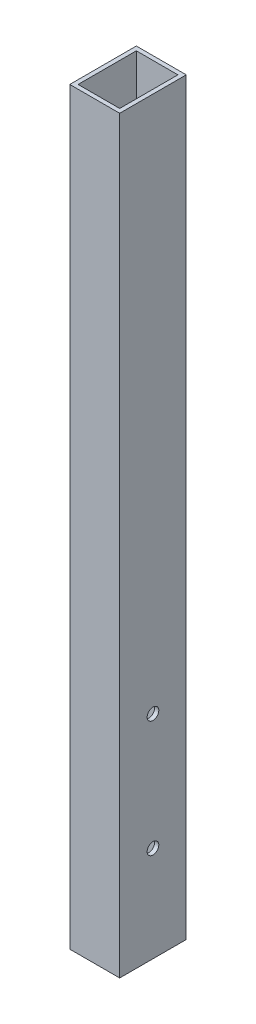
ISO-10303-21;
HEADER;
FILE_DESCRIPTION(('STEP AP214'),'2;1');
FILE_NAME('part.step','',(''),(''),'','','');
FILE_SCHEMA(('AUTOMOTIVE_DESIGN { 1 0 10303 214 1 1 1 1 }'));
ENDSEC;
DATA;
#1=APPLICATION_CONTEXT('core data for automotive mechanical design processes');
#2=APPLICATION_PROTOCOL_DEFINITION('international standard','automotive_design',2000,#1);
#3=PRODUCT_CONTEXT('',#1,'mechanical');
#4=PRODUCT('Part','Part','',(#3));
#5=PRODUCT_RELATED_PRODUCT_CATEGORY('part','',(#4));
#6=PRODUCT_DEFINITION_FORMATION('','',#4);
#7=PRODUCT_DEFINITION_CONTEXT('part definition',#1,'design');
#8=PRODUCT_DEFINITION('design','',#6,#7);
#9=PRODUCT_DEFINITION_SHAPE('','',#8);
#10=(LENGTH_UNIT() NAMED_UNIT(*) SI_UNIT(.MILLI.,.METRE.));
#11=(NAMED_UNIT(*) PLANE_ANGLE_UNIT() SI_UNIT($,.RADIAN.));
#12=(NAMED_UNIT(*) SI_UNIT($,.STERADIAN.) SOLID_ANGLE_UNIT());
#13=UNCERTAINTY_MEASURE_WITH_UNIT(LENGTH_MEASURE(1.E-05),#10,'distance_accuracy_value','');
#14=(GEOMETRIC_REPRESENTATION_CONTEXT(3) GLOBAL_UNCERTAINTY_ASSIGNED_CONTEXT((#13)) GLOBAL_UNIT_ASSIGNED_CONTEXT((#10,
#11,#12)) REPRESENTATION_CONTEXT('',''));
#15=CARTESIAN_POINT('',(0.,0.,0.));
#16=DIRECTION('',(0.,0.,1.));
#17=DIRECTION('',(1.,0.,0.));
#18=AXIS2_PLACEMENT_3D('',#15,#16,#17);
#19=CARTESIAN_POINT('',(-38.1,-1143.,50.8));
#20=DIRECTION('',(-1.,0.,0.));
#21=DIRECTION('',(0.,0.,1.));
#22=AXIS2_PLACEMENT_3D('',#19,#20,#21);
#23=PLANE('',#22);
#24=CARTESIAN_POINT('',(-38.1,-996.95,0.));
#25=DIRECTION('',(1.,0.,0.));
#26=DIRECTION('',(0.,0.,-1.));
#27=AXIS2_PLACEMENT_3D('',#24,#25,#26);
#28=CIRCLE('',#27,8.8899999999999);
#29=CARTESIAN_POINT('',(-38.1,-996.95,-8.8899999999999));
#30=VERTEX_POINT('',#29);
#31=EDGE_CURVE('E175',#30,#30,#28,.T.);
#32=ORIENTED_EDGE('',*,*,#31,.T.);
#33=EDGE_LOOP('',(#32));
#34=FACE_BOUND('',#33,.T.);
#35=CARTESIAN_POINT('',(-38.1,-819.15,0.));
#36=DIRECTION('',(1.,0.,0.));
#37=DIRECTION('',(0.,0.,-1.));
#38=AXIS2_PLACEMENT_3D('',#35,#36,#37);
#39=CIRCLE('',#38,8.88999999999989);
#40=CARTESIAN_POINT('',(-38.1,-819.15,-8.88999999999989));
#41=VERTEX_POINT('',#40);
#42=EDGE_CURVE('E185',#41,#41,#39,.T.);
#43=ORIENTED_EDGE('',*,*,#42,.T.);
#44=EDGE_LOOP('',(#43));
#45=FACE_BOUND('',#44,.T.);
#46=DIRECTION('',(0.,0.,1.));
#47=VECTOR('',#46,1.);
#48=CARTESIAN_POINT('',(-38.1,0.,50.8));
#49=LINE('',#48,#47);
#50=CARTESIAN_POINT('',(-38.1,0.,-50.8));
#51=VERTEX_POINT('',#50);
#52=CARTESIAN_POINT('',(-38.1,0.,50.8));
#53=VERTEX_POINT('',#52);
#54=EDGE_CURVE('E141',#51,#53,#49,.T.);
#55=ORIENTED_EDGE('',*,*,#54,.F.);
#56=DIRECTION('',(0.,1.,0.));
#57=VECTOR('',#56,1.);
#58=CARTESIAN_POINT('',(-38.1,-1143.,-50.8));
#59=LINE('',#58,#57);
#60=CARTESIAN_POINT('',(-38.1,-1143.,-50.8));
#61=VERTEX_POINT('',#60);
#62=EDGE_CURVE('E11',#61,#51,#59,.T.);
#63=ORIENTED_EDGE('',*,*,#62,.F.);
#64=DIRECTION('',(0.,0.,1.));
#65=VECTOR('',#64,1.);
#66=CARTESIAN_POINT('',(-38.1,-1143.,50.8));
#67=LINE('',#66,#65);
#68=CARTESIAN_POINT('',(-38.1,-1143.,50.8));
#69=VERTEX_POINT('',#68);
#70=EDGE_CURVE('E145',#61,#69,#67,.T.);
#71=ORIENTED_EDGE('',*,*,#70,.T.);
#72=DIRECTION('',(0.,1.,0.));
#73=VECTOR('',#72,1.);
#74=CARTESIAN_POINT('',(-38.1,-1143.,50.8));
#75=LINE('',#74,#73);
#76=EDGE_CURVE('E158',#69,#53,#75,.T.);
#77=ORIENTED_EDGE('',*,*,#76,.T.);
#78=EDGE_LOOP('',(#55,#63,#71,#77));
#79=FACE_BOUND('',#78,.T.);
#80=ADVANCED_FACE('F40',(#34,#45,#79),#23,.T.);
#81=CARTESIAN_POINT('',(38.1,-1143.,-50.8));
#82=DIRECTION('',(0.,0.,-1.));
#83=DIRECTION('',(-1.,0.,0.));
#84=AXIS2_PLACEMENT_3D('',#81,#82,#83);
#85=PLANE('',#84);
#86=DIRECTION('',(-1.,0.,0.));
#87=VECTOR('',#86,1.);
#88=CARTESIAN_POINT('',(38.1,0.,-50.8));
#89=LINE('',#88,#87);
#90=CARTESIAN_POINT('',(38.1,0.,-50.8));
#91=VERTEX_POINT('',#90);
#92=EDGE_CURVE('E149',#91,#51,#89,.T.);
#93=ORIENTED_EDGE('',*,*,#92,.F.);
#94=DIRECTION('',(0.,1.,0.));
#95=VECTOR('',#94,1.);
#96=CARTESIAN_POINT('',(38.1,-1143.,-50.8));
#97=LINE('',#96,#95);
#98=CARTESIAN_POINT('',(38.1,-1143.,-50.8));
#99=VERTEX_POINT('',#98);
#100=EDGE_CURVE('E48',#99,#91,#97,.T.);
#101=ORIENTED_EDGE('',*,*,#100,.F.);
#102=DIRECTION('',(-1.,0.,0.));
#103=VECTOR('',#102,1.);
#104=CARTESIAN_POINT('',(38.1,-1143.,-50.8));
#105=LINE('',#104,#103);
#106=EDGE_CURVE('E155',#99,#61,#105,.T.);
#107=ORIENTED_EDGE('',*,*,#106,.T.);
#108=ORIENTED_EDGE('',*,*,#62,.T.);
#109=EDGE_LOOP('',(#93,#101,#107,#108));
#110=FACE_BOUND('',#109,.T.);
#111=ADVANCED_FACE('F201',(#110),#85,.T.);
#112=CARTESIAN_POINT('',(38.1,-1143.,50.8));
#113=DIRECTION('',(1.,0.,0.));
#114=DIRECTION('',(0.,0.,-1.));
#115=AXIS2_PLACEMENT_3D('',#112,#113,#114);
#116=PLANE('',#115);
#117=CARTESIAN_POINT('',(38.1,-996.95,0.));
#118=DIRECTION('',(1.,0.,0.));
#119=DIRECTION('',(0.,0.,-1.));
#120=AXIS2_PLACEMENT_3D('',#117,#118,#119);
#121=CIRCLE('',#120,8.8899999999999);
#122=CARTESIAN_POINT('',(38.1,-996.95,-8.8899999999999));
#123=VERTEX_POINT('',#122);
#124=EDGE_CURVE('E180',#123,#123,#121,.T.);
#125=ORIENTED_EDGE('',*,*,#124,.F.);
#126=EDGE_LOOP('',(#125));
#127=FACE_BOUND('',#126,.T.);
#128=CARTESIAN_POINT('',(38.1,-819.15,0.));
#129=DIRECTION('',(1.,0.,0.));
#130=DIRECTION('',(0.,0.,-1.));
#131=AXIS2_PLACEMENT_3D('',#128,#129,#130);
#132=CIRCLE('',#131,8.88999999999989);
#133=CARTESIAN_POINT('',(38.1,-819.15,-8.88999999999989));
#134=VERTEX_POINT('',#133);
#135=EDGE_CURVE('E190',#134,#134,#132,.T.);
#136=ORIENTED_EDGE('',*,*,#135,.F.);
#137=EDGE_LOOP('',(#136));
#138=FACE_BOUND('',#137,.T.);
#139=DIRECTION('',(0.,0.,-1.));
#140=VECTOR('',#139,1.);
#141=CARTESIAN_POINT('',(38.1,0.,50.8));
#142=LINE('',#141,#140);
#143=CARTESIAN_POINT('',(38.1,0.,50.8));
#144=VERTEX_POINT('',#143);
#145=EDGE_CURVE('E164',#144,#91,#142,.T.);
#146=ORIENTED_EDGE('',*,*,#145,.F.);
#147=DIRECTION('',(0.,1.,0.));
#148=VECTOR('',#147,1.);
#149=CARTESIAN_POINT('',(38.1,-1143.,50.8));
#150=LINE('',#149,#148);
#151=CARTESIAN_POINT('',(38.1,-1143.,50.8));
#152=VERTEX_POINT('',#151);
#153=EDGE_CURVE('E170',#152,#144,#150,.T.);
#154=ORIENTED_EDGE('',*,*,#153,.F.);
#155=DIRECTION('',(0.,0.,-1.));
#156=VECTOR('',#155,1.);
#157=CARTESIAN_POINT('',(38.1,-1143.,50.8));
#158=LINE('',#157,#156);
#159=EDGE_CURVE('E152',#152,#99,#158,.T.);
#160=ORIENTED_EDGE('',*,*,#159,.T.);
#161=ORIENTED_EDGE('',*,*,#100,.T.);
#162=EDGE_LOOP('',(#146,#154,#160,#161));
#163=FACE_BOUND('',#162,.T.);
#164=ADVANCED_FACE('F197',(#127,#138,#163),#116,.T.);
#165=CARTESIAN_POINT('',(38.1,-1143.,50.8));
#166=DIRECTION('',(0.,0.,1.));
#167=DIRECTION('',(1.,0.,0.));
#168=AXIS2_PLACEMENT_3D('',#165,#166,#167);
#169=PLANE('',#168);
#170=DIRECTION('',(1.,0.,0.));
#171=VECTOR('',#170,1.);
#172=CARTESIAN_POINT('',(38.1,0.,50.8));
#173=LINE('',#172,#171);
#174=EDGE_CURVE('E161',#53,#144,#173,.T.);
#175=ORIENTED_EDGE('',*,*,#174,.F.);
#176=ORIENTED_EDGE('',*,*,#76,.F.);
#177=DIRECTION('',(1.,0.,0.));
#178=VECTOR('',#177,1.);
#179=CARTESIAN_POINT('',(38.1,-1143.,50.8));
#180=LINE('',#179,#178);
#181=EDGE_CURVE('E148',#69,#152,#180,.T.);
#182=ORIENTED_EDGE('',*,*,#181,.T.);
#183=ORIENTED_EDGE('',*,*,#153,.T.);
#184=EDGE_LOOP('',(#175,#176,#182,#183));
#185=FACE_BOUND('',#184,.T.);
#186=ADVANCED_FACE('F200',(#185),#169,.T.);
#187=CARTESIAN_POINT('',(0.,-1143.,0.));
#188=DIRECTION('',(0.,1.,0.));
#189=DIRECTION('',(0.,0.,1.));
#190=AXIS2_PLACEMENT_3D('',#187,#188,#189);
#191=PLANE('',#190);
#192=DIRECTION('',(-1.,0.,0.));
#193=VECTOR('',#192,1.);
#194=CARTESIAN_POINT('',(-31.75,-1143.,44.45));
#195=LINE('',#194,#193);
#196=CARTESIAN_POINT('',(31.75,-1143.,44.45));
#197=VERTEX_POINT('',#196);
#198=CARTESIAN_POINT('',(-31.75,-1143.,44.45));
#199=VERTEX_POINT('',#198);
#200=EDGE_CURVE('E135',#197,#199,#195,.T.);
#201=ORIENTED_EDGE('',*,*,#200,.F.);
#202=DIRECTION('',(0.,0.,1.));
#203=VECTOR('',#202,1.);
#204=CARTESIAN_POINT('',(31.75,-1143.,44.45));
#205=LINE('',#204,#203);
#206=CARTESIAN_POINT('',(31.75,-1143.,-44.45));
#207=VERTEX_POINT('',#206);
#208=EDGE_CURVE('E56',#207,#197,#205,.T.);
#209=ORIENTED_EDGE('',*,*,#208,.F.);
#210=DIRECTION('',(1.,0.,0.));
#211=VECTOR('',#210,1.);
#212=CARTESIAN_POINT('',(-31.75,-1143.,-44.45));
#213=LINE('',#212,#211);
#214=CARTESIAN_POINT('',(-31.75,-1143.,-44.45));
#215=VERTEX_POINT('',#214);
#216=EDGE_CURVE('E123',#215,#207,#213,.T.);
#217=ORIENTED_EDGE('',*,*,#216,.F.);
#218=DIRECTION('',(0.,0.,-1.));
#219=VECTOR('',#218,1.);
#220=CARTESIAN_POINT('',(-31.75,-1143.,44.45));
#221=LINE('',#220,#219);
#222=EDGE_CURVE('E126',#199,#215,#221,.T.);
#223=ORIENTED_EDGE('',*,*,#222,.F.);
#224=EDGE_LOOP('',(#201,#209,#217,#223));
#225=FACE_BOUND('',#224,.T.);
#226=ORIENTED_EDGE('',*,*,#70,.F.);
#227=ORIENTED_EDGE('',*,*,#106,.F.);
#228=ORIENTED_EDGE('',*,*,#159,.F.);
#229=ORIENTED_EDGE('',*,*,#181,.F.);
#230=EDGE_LOOP('',(#226,#227,#228,#229));
#231=FACE_BOUND('',#230,.T.);
#232=ADVANCED_FACE('F213',(#225,#231),#191,.F.);
#233=CARTESIAN_POINT('',(0.,0.,0.));
#234=DIRECTION('',(0.,1.,0.));
#235=DIRECTION('',(0.,0.,1.));
#236=AXIS2_PLACEMENT_3D('',#233,#234,#235);
#237=PLANE('',#236);
#238=DIRECTION('',(0.,0.,1.));
#239=VECTOR('',#238,1.);
#240=CARTESIAN_POINT('',(31.75,0.,44.45));
#241=LINE('',#240,#239);
#242=CARTESIAN_POINT('',(31.75,0.,-44.45));
#243=VERTEX_POINT('',#242);
#244=CARTESIAN_POINT('',(31.75,0.,44.45));
#245=VERTEX_POINT('',#244);
#246=EDGE_CURVE('E107',#243,#245,#241,.T.);
#247=ORIENTED_EDGE('',*,*,#246,.T.);
#248=DIRECTION('',(-1.,0.,0.));
#249=VECTOR('',#248,1.);
#250=CARTESIAN_POINT('',(-31.75,0.,44.45));
#251=LINE('',#250,#249);
#252=CARTESIAN_POINT('',(-31.75,0.,44.45));
#253=VERTEX_POINT('',#252);
#254=EDGE_CURVE('E116',#245,#253,#251,.T.);
#255=ORIENTED_EDGE('',*,*,#254,.T.);
#256=DIRECTION('',(0.,0.,-1.));
#257=VECTOR('',#256,1.);
#258=CARTESIAN_POINT('',(-31.75,0.,44.45));
#259=LINE('',#258,#257);
#260=CARTESIAN_POINT('',(-31.75,0.,-44.45));
#261=VERTEX_POINT('',#260);
#262=EDGE_CURVE('E64',#253,#261,#259,.T.);
#263=ORIENTED_EDGE('',*,*,#262,.T.);
#264=DIRECTION('',(1.,0.,0.));
#265=VECTOR('',#264,1.);
#266=CARTESIAN_POINT('',(-31.75,0.,-44.45));
#267=LINE('',#266,#265);
#268=EDGE_CURVE('E113',#261,#243,#267,.T.);
#269=ORIENTED_EDGE('',*,*,#268,.T.);
#270=EDGE_LOOP('',(#247,#255,#263,#269));
#271=FACE_BOUND('',#270,.T.);
#272=ORIENTED_EDGE('',*,*,#54,.T.);
#273=ORIENTED_EDGE('',*,*,#174,.T.);
#274=ORIENTED_EDGE('',*,*,#145,.T.);
#275=ORIENTED_EDGE('',*,*,#92,.T.);
#276=EDGE_LOOP('',(#272,#273,#274,#275));
#277=FACE_BOUND('',#276,.T.);
#278=ADVANCED_FACE('F120',(#271,#277),#237,.T.);
#279=CARTESIAN_POINT('',(31.75,0.,44.45));
#280=DIRECTION('',(1.,0.,0.));
#281=DIRECTION('',(0.,0.,-1.));
#282=AXIS2_PLACEMENT_3D('',#279,#280,#281);
#283=PLANE('',#282);
#284=CARTESIAN_POINT('',(31.75,-996.95,0.));
#285=DIRECTION('',(1.,0.,0.));
#286=DIRECTION('',(0.,0.,-1.));
#287=AXIS2_PLACEMENT_3D('',#284,#285,#286);
#288=CIRCLE('',#287,8.8899999999999);
#289=CARTESIAN_POINT('',(31.75,-996.95,-8.8899999999999));
#290=VERTEX_POINT('',#289);
#291=EDGE_CURVE('E129',#290,#290,#288,.T.);
#292=ORIENTED_EDGE('',*,*,#291,.T.);
#293=EDGE_LOOP('',(#292));
#294=FACE_BOUND('',#293,.T.);
#295=CARTESIAN_POINT('',(31.75,-819.15,0.));
#296=DIRECTION('',(1.,0.,0.));
#297=DIRECTION('',(0.,0.,-1.));
#298=AXIS2_PLACEMENT_3D('',#295,#296,#297);
#299=CIRCLE('',#298,8.88999999999989);
#300=CARTESIAN_POINT('',(31.75,-819.15,-8.88999999999989));
#301=VERTEX_POINT('',#300);
#302=EDGE_CURVE('E174',#301,#301,#299,.T.);
#303=ORIENTED_EDGE('',*,*,#302,.T.);
#304=EDGE_LOOP('',(#303));
#305=FACE_BOUND('',#304,.T.);
#306=ORIENTED_EDGE('',*,*,#208,.T.);
#307=DIRECTION('',(0.,-1.,0.));
#308=VECTOR('',#307,1.);
#309=CARTESIAN_POINT('',(31.75,0.,44.45));
#310=LINE('',#309,#308);
#311=EDGE_CURVE('E103',#245,#197,#310,.T.);
#312=ORIENTED_EDGE('',*,*,#311,.F.);
#313=ORIENTED_EDGE('',*,*,#246,.F.);
#314=DIRECTION('',(0.,-1.,0.));
#315=VECTOR('',#314,1.);
#316=CARTESIAN_POINT('',(31.75,0.,-44.45));
#317=LINE('',#316,#315);
#318=EDGE_CURVE('E139',#243,#207,#317,.T.);
#319=ORIENTED_EDGE('',*,*,#318,.T.);
#320=EDGE_LOOP('',(#306,#312,#313,#319));
#321=FACE_BOUND('',#320,.T.);
#322=ADVANCED_FACE('F105',(#294,#305,#321),#283,.F.);
#323=CARTESIAN_POINT('',(-31.75,0.,-44.45));
#324=DIRECTION('',(0.,0.,-1.));
#325=DIRECTION('',(-1.,0.,0.));
#326=AXIS2_PLACEMENT_3D('',#323,#324,#325);
#327=PLANE('',#326);
#328=ORIENTED_EDGE('',*,*,#216,.T.);
#329=ORIENTED_EDGE('',*,*,#318,.F.);
#330=ORIENTED_EDGE('',*,*,#268,.F.);
#331=DIRECTION('',(0.,-1.,0.));
#332=VECTOR('',#331,1.);
#333=CARTESIAN_POINT('',(-31.75,0.,-44.45));
#334=LINE('',#333,#332);
#335=EDGE_CURVE('E142',#261,#215,#334,.T.);
#336=ORIENTED_EDGE('',*,*,#335,.T.);
#337=EDGE_LOOP('',(#328,#329,#330,#336));
#338=FACE_BOUND('',#337,.T.);
#339=ADVANCED_FACE('F235',(#338),#327,.F.);
#340=CARTESIAN_POINT('',(-31.75,0.,44.45));
#341=DIRECTION('',(-1.,0.,0.));
#342=DIRECTION('',(0.,0.,1.));
#343=AXIS2_PLACEMENT_3D('',#340,#341,#342);
#344=PLANE('',#343);
#345=CARTESIAN_POINT('',(-31.75,-996.95,0.));
#346=DIRECTION('',(-1.,0.,0.));
#347=DIRECTION('',(0.,0.,1.));
#348=AXIS2_PLACEMENT_3D('',#345,#346,#347);
#349=CIRCLE('',#348,8.8899999999999);
#350=CARTESIAN_POINT('',(-31.75,-996.95,-8.8899999999999));
#351=VERTEX_POINT('',#350);
#352=EDGE_CURVE('E43',#351,#351,#349,.T.);
#353=ORIENTED_EDGE('',*,*,#352,.T.);
#354=EDGE_LOOP('',(#353));
#355=FACE_BOUND('',#354,.T.);
#356=CARTESIAN_POINT('',(-31.75,-819.15,0.));
#357=DIRECTION('',(-1.,0.,0.));
#358=DIRECTION('',(0.,0.,1.));
#359=AXIS2_PLACEMENT_3D('',#356,#357,#358);
#360=CIRCLE('',#359,8.88999999999989);
#361=CARTESIAN_POINT('',(-31.75,-819.15,-8.88999999999989));
#362=VERTEX_POINT('',#361);
#363=EDGE_CURVE('E172',#362,#362,#360,.T.);
#364=ORIENTED_EDGE('',*,*,#363,.T.);
#365=EDGE_LOOP('',(#364));
#366=FACE_BOUND('',#365,.T.);
#367=ORIENTED_EDGE('',*,*,#222,.T.);
#368=ORIENTED_EDGE('',*,*,#335,.F.);
#369=ORIENTED_EDGE('',*,*,#262,.F.);
#370=DIRECTION('',(0.,-1.,0.));
#371=VECTOR('',#370,1.);
#372=CARTESIAN_POINT('',(-31.75,0.,44.45));
#373=LINE('',#372,#371);
#374=EDGE_CURVE('E112',#253,#199,#373,.T.);
#375=ORIENTED_EDGE('',*,*,#374,.T.);
#376=EDGE_LOOP('',(#367,#368,#369,#375));
#377=FACE_BOUND('',#376,.T.);
#378=ADVANCED_FACE('F240',(#355,#366,#377),#344,.F.);
#379=CARTESIAN_POINT('',(-31.75,0.,44.45));
#380=DIRECTION('',(0.,0.,1.));
#381=DIRECTION('',(1.,0.,0.));
#382=AXIS2_PLACEMENT_3D('',#379,#380,#381);
#383=PLANE('',#382);
#384=ORIENTED_EDGE('',*,*,#200,.T.);
#385=ORIENTED_EDGE('',*,*,#374,.F.);
#386=ORIENTED_EDGE('',*,*,#254,.F.);
#387=ORIENTED_EDGE('',*,*,#311,.T.);
#388=EDGE_LOOP('',(#384,#385,#386,#387));
#389=FACE_BOUND('',#388,.T.);
#390=ADVANCED_FACE('F117',(#389),#383,.F.);
#391=CARTESIAN_POINT('',(-38.1,-819.15,0.));
#392=DIRECTION('',(1.,0.,0.));
#393=DIRECTION('',(0.,0.,-1.));
#394=AXIS2_PLACEMENT_3D('',#391,#392,#393);
#395=CYLINDRICAL_SURFACE('',#394,8.88999999999989);
#396=CARTESIAN_POINT('',(-38.1,-819.15,-8.88999999999989));
#397=CARTESIAN_POINT('',(-38.0338541666667,-819.15,-8.88999999999989));
#398=CARTESIAN_POINT('',(-37.9677083333333,-819.15,-8.88999999999989));
#399=CARTESIAN_POINT('',(-37.8354166666667,-819.15,-8.88999999999989));
#400=CARTESIAN_POINT('',(-37.7692708333333,-819.15,-8.88999999999989));
#401=CARTESIAN_POINT('',(-37.6369791666667,-819.15,-8.88999999999989));
#402=CARTESIAN_POINT('',(-37.5708333333333,-819.15,-8.88999999999989));
#403=CARTESIAN_POINT('',(-37.4385416666667,-819.15,-8.88999999999989));
#404=CARTESIAN_POINT('',(-37.3723958333333,-819.15,-8.88999999999989));
#405=CARTESIAN_POINT('',(-37.2401041666667,-819.15,-8.88999999999989));
#406=CARTESIAN_POINT('',(-37.1739583333333,-819.15,-8.88999999999989));
#407=CARTESIAN_POINT('',(-37.0416666666667,-819.15,-8.88999999999989));
#408=CARTESIAN_POINT('',(-36.9755208333333,-819.15,-8.88999999999989));
#409=CARTESIAN_POINT('',(-36.8432291666667,-819.15,-8.88999999999989));
#410=CARTESIAN_POINT('',(-36.7770833333333,-819.15,-8.88999999999989));
#411=CARTESIAN_POINT('',(-36.6447916666667,-819.15,-8.88999999999989));
#412=CARTESIAN_POINT('',(-36.5786458333333,-819.15,-8.88999999999989));
#413=CARTESIAN_POINT('',(-36.4463541666667,-819.15,-8.88999999999989));
#414=CARTESIAN_POINT('',(-36.3802083333333,-819.15,-8.88999999999989));
#415=CARTESIAN_POINT('',(-36.2479166666667,-819.15,-8.88999999999989));
#416=CARTESIAN_POINT('',(-36.1817708333333,-819.15,-8.88999999999989));
#417=CARTESIAN_POINT('',(-36.0494791666667,-819.15,-8.88999999999989));
#418=CARTESIAN_POINT('',(-35.9833333333333,-819.15,-8.88999999999989));
#419=CARTESIAN_POINT('',(-35.8510416666667,-819.15,-8.88999999999989));
#420=CARTESIAN_POINT('',(-35.7848958333333,-819.15,-8.88999999999989));
#421=CARTESIAN_POINT('',(-35.6526041666667,-819.15,-8.88999999999989));
#422=CARTESIAN_POINT('',(-35.5864583333333,-819.15,-8.88999999999989));
#423=CARTESIAN_POINT('',(-35.4541666666667,-819.15,-8.88999999999989));
#424=CARTESIAN_POINT('',(-35.3880208333333,-819.15,-8.88999999999989));
#425=CARTESIAN_POINT('',(-35.2557291666667,-819.15,-8.88999999999989));
#426=CARTESIAN_POINT('',(-35.1895833333333,-819.15,-8.88999999999989));
#427=CARTESIAN_POINT('',(-35.0572916666667,-819.15,-8.88999999999989));
#428=CARTESIAN_POINT('',(-34.9911458333333,-819.15,-8.88999999999989));
#429=CARTESIAN_POINT('',(-34.8588541666667,-819.15,-8.88999999999989));
#430=CARTESIAN_POINT('',(-34.7927083333333,-819.15,-8.88999999999989));
#431=CARTESIAN_POINT('',(-34.6604166666667,-819.15,-8.88999999999989));
#432=CARTESIAN_POINT('',(-34.5942708333333,-819.15,-8.88999999999989));
#433=CARTESIAN_POINT('',(-34.4619791666667,-819.15,-8.88999999999989));
#434=CARTESIAN_POINT('',(-34.3958333333333,-819.15,-8.88999999999989));
#435=CARTESIAN_POINT('',(-34.2635416666667,-819.15,-8.88999999999989));
#436=CARTESIAN_POINT('',(-34.1973958333333,-819.15,-8.88999999999989));
#437=CARTESIAN_POINT('',(-34.0651041666667,-819.15,-8.88999999999989));
#438=CARTESIAN_POINT('',(-33.9989583333333,-819.15,-8.88999999999989));
#439=CARTESIAN_POINT('',(-33.8666666666667,-819.15,-8.88999999999989));
#440=CARTESIAN_POINT('',(-33.8005208333333,-819.15,-8.88999999999989));
#441=CARTESIAN_POINT('',(-33.6682291666667,-819.15,-8.88999999999989));
#442=CARTESIAN_POINT('',(-33.6020833333333,-819.15,-8.88999999999989));
#443=CARTESIAN_POINT('',(-33.4697916666667,-819.15,-8.88999999999989));
#444=CARTESIAN_POINT('',(-33.4036458333333,-819.15,-8.88999999999989));
#445=CARTESIAN_POINT('',(-33.2713541666667,-819.15,-8.88999999999989));
#446=CARTESIAN_POINT('',(-33.2052083333333,-819.15,-8.88999999999989));
#447=CARTESIAN_POINT('',(-33.0729166666667,-819.15,-8.88999999999989));
#448=CARTESIAN_POINT('',(-33.0067708333333,-819.15,-8.88999999999989));
#449=CARTESIAN_POINT('',(-32.8744791666667,-819.15,-8.88999999999989));
#450=CARTESIAN_POINT('',(-32.8083333333333,-819.15,-8.88999999999989));
#451=CARTESIAN_POINT('',(-32.6760416666667,-819.15,-8.88999999999989));
#452=CARTESIAN_POINT('',(-32.6098958333333,-819.15,-8.88999999999989));
#453=CARTESIAN_POINT('',(-32.4776041666667,-819.15,-8.88999999999989));
#454=CARTESIAN_POINT('',(-32.4114583333333,-819.15,-8.88999999999989));
#455=CARTESIAN_POINT('',(-32.2791666666667,-819.15,-8.88999999999989));
#456=CARTESIAN_POINT('',(-32.2130208333333,-819.15,-8.88999999999989));
#457=CARTESIAN_POINT('',(-32.0807291666667,-819.15,-8.88999999999989));
#458=CARTESIAN_POINT('',(-32.0145833333333,-819.15,-8.88999999999989));
#459=CARTESIAN_POINT('',(-31.8822916666667,-819.15,-8.88999999999989));
#460=CARTESIAN_POINT('',(-31.8161458333333,-819.15,-8.88999999999989));
#461=CARTESIAN_POINT('',(-31.75,-819.15,-8.88999999999989));
#462=B_SPLINE_CURVE_WITH_KNOTS('',3,(#396,#397,#398,#399,#400,#401,#402,#403,#404,#405,#406,
#407,#408,#409,#410,#411,#412,#413,#414,#415,#416,#417,#418,#419,#420,#421,#422,#423,#424,#425,
#426,#427,#428,#429,#430,#431,#432,#433,#434,#435,#436,#437,#438,#439,#440,#441,#442,#443,#444,
#445,#446,#447,#448,#449,#450,#451,#452,#453,#454,#455,#456,#457,#458,#459,#460,#461),
.UNSPECIFIED.,.F.,.F.,(4,2,2,2,2,2,2,2,2,2,2,2,2,2,2,2,2,2,2,2,2,2,2,2,2,2,2,2,2,2,2,2,4),(0.,
0.198437499999995,0.396874999999998,0.595312499999993,0.793749999999996,0.992187499999998,
1.19062499999999,1.3890625,1.58749999999999,1.78593749999999,1.984375,2.18281249999999,
2.38124999999999,2.5796875,2.77812499999999,2.97656249999999,3.17499999999999,3.37343749999999,
3.571875,3.77031249999999,3.96874999999999,4.16718749999999,4.36562499999999,4.56406249999999,
4.76249999999999,4.96093749999999,5.15937499999999,5.35781249999999,5.55624999999999,
5.75468749999999,5.95312499999999,6.15156249999999,6.34999999999999),.UNSPECIFIED.);
#463=EDGE_CURVE('BSEAM239',#41,#362,#462,.T.);
#464=ORIENTED_EDGE('',*,*,#42,.F.);
#465=ORIENTED_EDGE('',*,*,#363,.F.);
#466=ORIENTED_EDGE('',*,*,#463,.T.);
#467=ORIENTED_EDGE('',*,*,#463,.F.);
#468=EDGE_LOOP('',(#464,#466,#465,#467));
#469=FACE_BOUND('',#468,.T.);
#470=ADVANCED_FACE('F239',(#469),#395,.F.);
#471=CARTESIAN_POINT('',(-38.1,-996.95,0.));
#472=DIRECTION('',(1.,0.,0.));
#473=DIRECTION('',(0.,0.,-1.));
#474=AXIS2_PLACEMENT_3D('',#471,#472,#473);
#475=CYLINDRICAL_SURFACE('',#474,8.8899999999999);
#476=CARTESIAN_POINT('',(-38.1,-996.95,-8.8899999999999));
#477=CARTESIAN_POINT('',(-38.0338541666667,-996.95,-8.8899999999999));
#478=CARTESIAN_POINT('',(-37.9677083333333,-996.95,-8.8899999999999));
#479=CARTESIAN_POINT('',(-37.8354166666667,-996.95,-8.8899999999999));
#480=CARTESIAN_POINT('',(-37.7692708333333,-996.95,-8.8899999999999));
#481=CARTESIAN_POINT('',(-37.6369791666667,-996.95,-8.8899999999999));
#482=CARTESIAN_POINT('',(-37.5708333333333,-996.95,-8.8899999999999));
#483=CARTESIAN_POINT('',(-37.4385416666667,-996.95,-8.8899999999999));
#484=CARTESIAN_POINT('',(-37.3723958333333,-996.95,-8.8899999999999));
#485=CARTESIAN_POINT('',(-37.2401041666667,-996.95,-8.8899999999999));
#486=CARTESIAN_POINT('',(-37.1739583333333,-996.95,-8.8899999999999));
#487=CARTESIAN_POINT('',(-37.0416666666667,-996.95,-8.8899999999999));
#488=CARTESIAN_POINT('',(-36.9755208333333,-996.95,-8.8899999999999));
#489=CARTESIAN_POINT('',(-36.8432291666667,-996.95,-8.8899999999999));
#490=CARTESIAN_POINT('',(-36.7770833333333,-996.95,-8.8899999999999));
#491=CARTESIAN_POINT('',(-36.6447916666667,-996.95,-8.8899999999999));
#492=CARTESIAN_POINT('',(-36.5786458333333,-996.95,-8.8899999999999));
#493=CARTESIAN_POINT('',(-36.4463541666667,-996.95,-8.8899999999999));
#494=CARTESIAN_POINT('',(-36.3802083333333,-996.95,-8.8899999999999));
#495=CARTESIAN_POINT('',(-36.2479166666667,-996.95,-8.8899999999999));
#496=CARTESIAN_POINT('',(-36.1817708333333,-996.95,-8.8899999999999));
#497=CARTESIAN_POINT('',(-36.0494791666667,-996.95,-8.8899999999999));
#498=CARTESIAN_POINT('',(-35.9833333333333,-996.95,-8.8899999999999));
#499=CARTESIAN_POINT('',(-35.8510416666667,-996.95,-8.8899999999999));
#500=CARTESIAN_POINT('',(-35.7848958333333,-996.95,-8.8899999999999));
#501=CARTESIAN_POINT('',(-35.6526041666667,-996.95,-8.8899999999999));
#502=CARTESIAN_POINT('',(-35.5864583333333,-996.95,-8.8899999999999));
#503=CARTESIAN_POINT('',(-35.4541666666667,-996.95,-8.8899999999999));
#504=CARTESIAN_POINT('',(-35.3880208333333,-996.95,-8.8899999999999));
#505=CARTESIAN_POINT('',(-35.2557291666667,-996.95,-8.8899999999999));
#506=CARTESIAN_POINT('',(-35.1895833333333,-996.95,-8.8899999999999));
#507=CARTESIAN_POINT('',(-35.0572916666667,-996.95,-8.8899999999999));
#508=CARTESIAN_POINT('',(-34.9911458333333,-996.95,-8.8899999999999));
#509=CARTESIAN_POINT('',(-34.8588541666667,-996.95,-8.8899999999999));
#510=CARTESIAN_POINT('',(-34.7927083333333,-996.95,-8.8899999999999));
#511=CARTESIAN_POINT('',(-34.6604166666667,-996.95,-8.8899999999999));
#512=CARTESIAN_POINT('',(-34.5942708333333,-996.95,-8.8899999999999));
#513=CARTESIAN_POINT('',(-34.4619791666667,-996.95,-8.8899999999999));
#514=CARTESIAN_POINT('',(-34.3958333333333,-996.95,-8.8899999999999));
#515=CARTESIAN_POINT('',(-34.2635416666667,-996.95,-8.8899999999999));
#516=CARTESIAN_POINT('',(-34.1973958333333,-996.95,-8.8899999999999));
#517=CARTESIAN_POINT('',(-34.0651041666667,-996.95,-8.8899999999999));
#518=CARTESIAN_POINT('',(-33.9989583333333,-996.95,-8.8899999999999));
#519=CARTESIAN_POINT('',(-33.8666666666667,-996.95,-8.8899999999999));
#520=CARTESIAN_POINT('',(-33.8005208333333,-996.95,-8.8899999999999));
#521=CARTESIAN_POINT('',(-33.6682291666667,-996.95,-8.8899999999999));
#522=CARTESIAN_POINT('',(-33.6020833333333,-996.95,-8.8899999999999));
#523=CARTESIAN_POINT('',(-33.4697916666667,-996.95,-8.8899999999999));
#524=CARTESIAN_POINT('',(-33.4036458333333,-996.95,-8.8899999999999));
#525=CARTESIAN_POINT('',(-33.2713541666667,-996.95,-8.8899999999999));
#526=CARTESIAN_POINT('',(-33.2052083333333,-996.95,-8.8899999999999));
#527=CARTESIAN_POINT('',(-33.0729166666667,-996.95,-8.8899999999999));
#528=CARTESIAN_POINT('',(-33.0067708333333,-996.95,-8.8899999999999));
#529=CARTESIAN_POINT('',(-32.8744791666667,-996.95,-8.8899999999999));
#530=CARTESIAN_POINT('',(-32.8083333333333,-996.95,-8.8899999999999));
#531=CARTESIAN_POINT('',(-32.6760416666667,-996.95,-8.8899999999999));
#532=CARTESIAN_POINT('',(-32.6098958333333,-996.95,-8.8899999999999));
#533=CARTESIAN_POINT('',(-32.4776041666667,-996.95,-8.8899999999999));
#534=CARTESIAN_POINT('',(-32.4114583333333,-996.95,-8.8899999999999));
#535=CARTESIAN_POINT('',(-32.2791666666667,-996.95,-8.8899999999999));
#536=CARTESIAN_POINT('',(-32.2130208333333,-996.95,-8.8899999999999));
#537=CARTESIAN_POINT('',(-32.0807291666667,-996.95,-8.8899999999999));
#538=CARTESIAN_POINT('',(-32.0145833333333,-996.95,-8.8899999999999));
#539=CARTESIAN_POINT('',(-31.8822916666667,-996.95,-8.8899999999999));
#540=CARTESIAN_POINT('',(-31.8161458333333,-996.95,-8.8899999999999));
#541=CARTESIAN_POINT('',(-31.75,-996.95,-8.8899999999999));
#542=B_SPLINE_CURVE_WITH_KNOTS('',3,(#476,#477,#478,#479,#480,#481,#482,#483,#484,#485,#486,
#487,#488,#489,#490,#491,#492,#493,#494,#495,#496,#497,#498,#499,#500,#501,#502,#503,#504,#505,
#506,#507,#508,#509,#510,#511,#512,#513,#514,#515,#516,#517,#518,#519,#520,#521,#522,#523,#524,
#525,#526,#527,#528,#529,#530,#531,#532,#533,#534,#535,#536,#537,#538,#539,#540,#541),
.UNSPECIFIED.,.F.,.F.,(4,2,2,2,2,2,2,2,2,2,2,2,2,2,2,2,2,2,2,2,2,2,2,2,2,2,2,2,2,2,2,2,4),(0.,
0.198437499999995,0.396874999999998,0.595312499999993,0.793749999999996,0.992187499999998,
1.19062499999999,1.3890625,1.58749999999999,1.78593749999999,1.984375,2.18281249999999,
2.38124999999999,2.5796875,2.77812499999999,2.97656249999999,3.17499999999999,3.37343749999999,
3.571875,3.77031249999999,3.96874999999999,4.16718749999999,4.36562499999999,4.56406249999999,
4.76249999999999,4.96093749999999,5.15937499999999,5.35781249999999,5.55624999999999,
5.75468749999999,5.95312499999999,6.15156249999999,6.34999999999999),.UNSPECIFIED.);
#543=EDGE_CURVE('BSEAM250',#30,#351,#542,.T.);
#544=ORIENTED_EDGE('',*,*,#31,.F.);
#545=ORIENTED_EDGE('',*,*,#352,.F.);
#546=ORIENTED_EDGE('',*,*,#543,.T.);
#547=ORIENTED_EDGE('',*,*,#543,.F.);
#548=EDGE_LOOP('',(#544,#546,#545,#547));
#549=FACE_BOUND('',#548,.T.);
#550=ADVANCED_FACE('F250',(#549),#475,.F.);
#551=CARTESIAN_POINT('',(38.1,-819.15,-8.88999999999989));
#552=CARTESIAN_POINT('',(38.0338541666667,-819.15,-8.88999999999989));
#553=CARTESIAN_POINT('',(37.9677083333333,-819.15,-8.88999999999989));
#554=CARTESIAN_POINT('',(37.8354166666667,-819.15,-8.88999999999989));
#555=CARTESIAN_POINT('',(37.7692708333333,-819.15,-8.88999999999989));
#556=CARTESIAN_POINT('',(37.6369791666667,-819.15,-8.88999999999989));
#557=CARTESIAN_POINT('',(37.5708333333333,-819.15,-8.88999999999989));
#558=CARTESIAN_POINT('',(37.4385416666667,-819.15,-8.88999999999989));
#559=CARTESIAN_POINT('',(37.3723958333333,-819.15,-8.88999999999989));
#560=CARTESIAN_POINT('',(37.2401041666667,-819.15,-8.88999999999989));
#561=CARTESIAN_POINT('',(37.1739583333333,-819.15,-8.88999999999989));
#562=CARTESIAN_POINT('',(37.0416666666667,-819.15,-8.88999999999989));
#563=CARTESIAN_POINT('',(36.9755208333333,-819.15,-8.88999999999989));
#564=CARTESIAN_POINT('',(36.8432291666667,-819.15,-8.88999999999989));
#565=CARTESIAN_POINT('',(36.7770833333333,-819.15,-8.88999999999989));
#566=CARTESIAN_POINT('',(36.6447916666667,-819.15,-8.88999999999989));
#567=CARTESIAN_POINT('',(36.5786458333333,-819.15,-8.88999999999989));
#568=CARTESIAN_POINT('',(36.4463541666667,-819.15,-8.88999999999989));
#569=CARTESIAN_POINT('',(36.3802083333333,-819.15,-8.88999999999989));
#570=CARTESIAN_POINT('',(36.2479166666667,-819.15,-8.88999999999989));
#571=CARTESIAN_POINT('',(36.1817708333333,-819.15,-8.88999999999989));
#572=CARTESIAN_POINT('',(36.0494791666667,-819.15,-8.88999999999989));
#573=CARTESIAN_POINT('',(35.9833333333333,-819.15,-8.88999999999989));
#574=CARTESIAN_POINT('',(35.8510416666667,-819.15,-8.88999999999989));
#575=CARTESIAN_POINT('',(35.7848958333333,-819.15,-8.88999999999989));
#576=CARTESIAN_POINT('',(35.6526041666667,-819.15,-8.88999999999989));
#577=CARTESIAN_POINT('',(35.5864583333333,-819.15,-8.88999999999989));
#578=CARTESIAN_POINT('',(35.4541666666667,-819.15,-8.88999999999989));
#579=CARTESIAN_POINT('',(35.3880208333333,-819.15,-8.88999999999989));
#580=CARTESIAN_POINT('',(35.2557291666667,-819.15,-8.88999999999989));
#581=CARTESIAN_POINT('',(35.1895833333333,-819.15,-8.88999999999989));
#582=CARTESIAN_POINT('',(35.0572916666667,-819.15,-8.88999999999989));
#583=CARTESIAN_POINT('',(34.9911458333333,-819.15,-8.88999999999989));
#584=CARTESIAN_POINT('',(34.8588541666667,-819.15,-8.88999999999989));
#585=CARTESIAN_POINT('',(34.7927083333333,-819.15,-8.88999999999989));
#586=CARTESIAN_POINT('',(34.6604166666667,-819.15,-8.88999999999989));
#587=CARTESIAN_POINT('',(34.5942708333333,-819.15,-8.88999999999989));
#588=CARTESIAN_POINT('',(34.4619791666667,-819.15,-8.88999999999989));
#589=CARTESIAN_POINT('',(34.3958333333333,-819.15,-8.88999999999989));
#590=CARTESIAN_POINT('',(34.2635416666667,-819.15,-8.88999999999989));
#591=CARTESIAN_POINT('',(34.1973958333333,-819.15,-8.88999999999989));
#592=CARTESIAN_POINT('',(34.0651041666667,-819.15,-8.88999999999989));
#593=CARTESIAN_POINT('',(33.9989583333333,-819.15,-8.88999999999989));
#594=CARTESIAN_POINT('',(33.8666666666667,-819.15,-8.88999999999989));
#595=CARTESIAN_POINT('',(33.8005208333333,-819.15,-8.88999999999989));
#596=CARTESIAN_POINT('',(33.6682291666667,-819.15,-8.88999999999989));
#597=CARTESIAN_POINT('',(33.6020833333333,-819.15,-8.88999999999989));
#598=CARTESIAN_POINT('',(33.4697916666667,-819.15,-8.88999999999989));
#599=CARTESIAN_POINT('',(33.4036458333333,-819.15,-8.88999999999989));
#600=CARTESIAN_POINT('',(33.2713541666667,-819.15,-8.88999999999989));
#601=CARTESIAN_POINT('',(33.2052083333333,-819.15,-8.88999999999989));
#602=CARTESIAN_POINT('',(33.0729166666667,-819.15,-8.88999999999989));
#603=CARTESIAN_POINT('',(33.0067708333333,-819.15,-8.88999999999989));
#604=CARTESIAN_POINT('',(32.8744791666667,-819.15,-8.88999999999989));
#605=CARTESIAN_POINT('',(32.8083333333333,-819.15,-8.88999999999989));
#606=CARTESIAN_POINT('',(32.6760416666667,-819.15,-8.88999999999989));
#607=CARTESIAN_POINT('',(32.6098958333333,-819.15,-8.88999999999989));
#608=CARTESIAN_POINT('',(32.4776041666667,-819.15,-8.88999999999989));
#609=CARTESIAN_POINT('',(32.4114583333333,-819.15,-8.88999999999989));
#610=CARTESIAN_POINT('',(32.2791666666667,-819.15,-8.88999999999989));
#611=CARTESIAN_POINT('',(32.2130208333333,-819.15,-8.88999999999989));
#612=CARTESIAN_POINT('',(32.0807291666667,-819.15,-8.88999999999989));
#613=CARTESIAN_POINT('',(32.0145833333333,-819.15,-8.88999999999989));
#614=CARTESIAN_POINT('',(31.8822916666667,-819.15,-8.88999999999989));
#615=CARTESIAN_POINT('',(31.8161458333333,-819.15,-8.88999999999989));
#616=CARTESIAN_POINT('',(31.75,-819.15,-8.88999999999989));
#617=B_SPLINE_CURVE_WITH_KNOTS('',3,(#551,#552,#553,#554,#555,#556,#557,#558,#559,#560,#561,
#562,#563,#564,#565,#566,#567,#568,#569,#570,#571,#572,#573,#574,#575,#576,#577,#578,#579,#580,
#581,#582,#583,#584,#585,#586,#587,#588,#589,#590,#591,#592,#593,#594,#595,#596,#597,#598,#599,
#600,#601,#602,#603,#604,#605,#606,#607,#608,#609,#610,#611,#612,#613,#614,#615,#616),
.UNSPECIFIED.,.F.,.F.,(4,2,2,2,2,2,2,2,2,2,2,2,2,2,2,2,2,2,2,2,2,2,2,2,2,2,2,2,2,2,2,2,4),(0.,
0.198437499999995,0.396875000000005,0.5953125,0.79375000000001,0.992187500000005,1.190625,
1.38906250000001,1.58750000000001,1.7859375,1.98437500000001,2.18281250000001,2.38125,
2.57968750000001,2.77812500000001,2.97656250000002,3.17500000000001,3.37343750000001,
3.57187500000002,3.77031250000001,3.96875000000002,4.16718750000002,4.36562500000001,
4.56406250000002,4.76250000000002,4.96093750000001,5.15937500000002,5.35781250000002,
5.55625000000001,5.75468750000002,5.95312500000002,6.15156250000003,6.35000000000002),.UNSPECIFIED.);
#618=EDGE_CURVE('BSEAM194',#134,#301,#617,.T.);
#619=ORIENTED_EDGE('',*,*,#135,.T.);
#620=ORIENTED_EDGE('',*,*,#302,.F.);
#621=ORIENTED_EDGE('',*,*,#618,.T.);
#622=ORIENTED_EDGE('',*,*,#618,.F.);
#623=EDGE_LOOP('',(#619,#621,#620,#622));
#624=FACE_BOUND('',#623,.T.);
#625=ADVANCED_FACE('F194',(#624),#395,.F.);
#626=CARTESIAN_POINT('',(38.1,-996.95,-8.8899999999999));
#627=CARTESIAN_POINT('',(38.0338541666667,-996.95,-8.8899999999999));
#628=CARTESIAN_POINT('',(37.9677083333333,-996.95,-8.8899999999999));
#629=CARTESIAN_POINT('',(37.8354166666667,-996.95,-8.8899999999999));
#630=CARTESIAN_POINT('',(37.7692708333333,-996.95,-8.8899999999999));
#631=CARTESIAN_POINT('',(37.6369791666667,-996.95,-8.8899999999999));
#632=CARTESIAN_POINT('',(37.5708333333333,-996.95,-8.8899999999999));
#633=CARTESIAN_POINT('',(37.4385416666667,-996.95,-8.8899999999999));
#634=CARTESIAN_POINT('',(37.3723958333333,-996.95,-8.8899999999999));
#635=CARTESIAN_POINT('',(37.2401041666667,-996.95,-8.8899999999999));
#636=CARTESIAN_POINT('',(37.1739583333333,-996.95,-8.8899999999999));
#637=CARTESIAN_POINT('',(37.0416666666667,-996.95,-8.8899999999999));
#638=CARTESIAN_POINT('',(36.9755208333333,-996.95,-8.8899999999999));
#639=CARTESIAN_POINT('',(36.8432291666667,-996.95,-8.8899999999999));
#640=CARTESIAN_POINT('',(36.7770833333333,-996.95,-8.8899999999999));
#641=CARTESIAN_POINT('',(36.6447916666667,-996.95,-8.8899999999999));
#642=CARTESIAN_POINT('',(36.5786458333333,-996.95,-8.8899999999999));
#643=CARTESIAN_POINT('',(36.4463541666667,-996.95,-8.8899999999999));
#644=CARTESIAN_POINT('',(36.3802083333333,-996.95,-8.8899999999999));
#645=CARTESIAN_POINT('',(36.2479166666667,-996.95,-8.8899999999999));
#646=CARTESIAN_POINT('',(36.1817708333333,-996.95,-8.8899999999999));
#647=CARTESIAN_POINT('',(36.0494791666667,-996.95,-8.8899999999999));
#648=CARTESIAN_POINT('',(35.9833333333333,-996.95,-8.8899999999999));
#649=CARTESIAN_POINT('',(35.8510416666667,-996.95,-8.8899999999999));
#650=CARTESIAN_POINT('',(35.7848958333333,-996.95,-8.8899999999999));
#651=CARTESIAN_POINT('',(35.6526041666667,-996.95,-8.8899999999999));
#652=CARTESIAN_POINT('',(35.5864583333333,-996.95,-8.8899999999999));
#653=CARTESIAN_POINT('',(35.4541666666667,-996.95,-8.8899999999999));
#654=CARTESIAN_POINT('',(35.3880208333333,-996.95,-8.8899999999999));
#655=CARTESIAN_POINT('',(35.2557291666667,-996.95,-8.8899999999999));
#656=CARTESIAN_POINT('',(35.1895833333333,-996.95,-8.8899999999999));
#657=CARTESIAN_POINT('',(35.0572916666667,-996.95,-8.8899999999999));
#658=CARTESIAN_POINT('',(34.9911458333333,-996.95,-8.8899999999999));
#659=CARTESIAN_POINT('',(34.8588541666667,-996.95,-8.8899999999999));
#660=CARTESIAN_POINT('',(34.7927083333333,-996.95,-8.8899999999999));
#661=CARTESIAN_POINT('',(34.6604166666667,-996.95,-8.8899999999999));
#662=CARTESIAN_POINT('',(34.5942708333333,-996.95,-8.8899999999999));
#663=CARTESIAN_POINT('',(34.4619791666667,-996.95,-8.8899999999999));
#664=CARTESIAN_POINT('',(34.3958333333333,-996.95,-8.8899999999999));
#665=CARTESIAN_POINT('',(34.2635416666667,-996.95,-8.8899999999999));
#666=CARTESIAN_POINT('',(34.1973958333333,-996.95,-8.8899999999999));
#667=CARTESIAN_POINT('',(34.0651041666667,-996.95,-8.8899999999999));
#668=CARTESIAN_POINT('',(33.9989583333333,-996.95,-8.8899999999999));
#669=CARTESIAN_POINT('',(33.8666666666667,-996.95,-8.8899999999999));
#670=CARTESIAN_POINT('',(33.8005208333333,-996.95,-8.8899999999999));
#671=CARTESIAN_POINT('',(33.6682291666667,-996.95,-8.8899999999999));
#672=CARTESIAN_POINT('',(33.6020833333333,-996.95,-8.8899999999999));
#673=CARTESIAN_POINT('',(33.4697916666667,-996.95,-8.8899999999999));
#674=CARTESIAN_POINT('',(33.4036458333333,-996.95,-8.8899999999999));
#675=CARTESIAN_POINT('',(33.2713541666667,-996.95,-8.8899999999999));
#676=CARTESIAN_POINT('',(33.2052083333333,-996.95,-8.8899999999999));
#677=CARTESIAN_POINT('',(33.0729166666667,-996.95,-8.8899999999999));
#678=CARTESIAN_POINT('',(33.0067708333333,-996.95,-8.8899999999999));
#679=CARTESIAN_POINT('',(32.8744791666667,-996.95,-8.8899999999999));
#680=CARTESIAN_POINT('',(32.8083333333333,-996.95,-8.8899999999999));
#681=CARTESIAN_POINT('',(32.6760416666667,-996.95,-8.8899999999999));
#682=CARTESIAN_POINT('',(32.6098958333333,-996.95,-8.8899999999999));
#683=CARTESIAN_POINT('',(32.4776041666667,-996.95,-8.8899999999999));
#684=CARTESIAN_POINT('',(32.4114583333333,-996.95,-8.8899999999999));
#685=CARTESIAN_POINT('',(32.2791666666667,-996.95,-8.8899999999999));
#686=CARTESIAN_POINT('',(32.2130208333333,-996.95,-8.8899999999999));
#687=CARTESIAN_POINT('',(32.0807291666667,-996.95,-8.8899999999999));
#688=CARTESIAN_POINT('',(32.0145833333333,-996.95,-8.8899999999999));
#689=CARTESIAN_POINT('',(31.8822916666667,-996.95,-8.8899999999999));
#690=CARTESIAN_POINT('',(31.8161458333333,-996.95,-8.8899999999999));
#691=CARTESIAN_POINT('',(31.75,-996.95,-8.8899999999999));
#692=B_SPLINE_CURVE_WITH_KNOTS('',3,(#626,#627,#628,#629,#630,#631,#632,#633,#634,#635,#636,
#637,#638,#639,#640,#641,#642,#643,#644,#645,#646,#647,#648,#649,#650,#651,#652,#653,#654,#655,
#656,#657,#658,#659,#660,#661,#662,#663,#664,#665,#666,#667,#668,#669,#670,#671,#672,#673,#674,
#675,#676,#677,#678,#679,#680,#681,#682,#683,#684,#685,#686,#687,#688,#689,#690,#691),
.UNSPECIFIED.,.F.,.F.,(4,2,2,2,2,2,2,2,2,2,2,2,2,2,2,2,2,2,2,2,2,2,2,2,2,2,2,2,2,2,2,2,4),(0.,
0.198437499999995,0.396875000000005,0.5953125,0.79375000000001,0.992187500000005,1.190625,
1.38906250000001,1.58750000000001,1.7859375,1.98437500000001,2.18281250000001,2.38125,
2.57968750000001,2.77812500000001,2.97656250000002,3.17500000000001,3.37343750000001,
3.57187500000002,3.77031250000001,3.96875000000002,4.16718750000002,4.36562500000001,
4.56406250000002,4.76250000000002,4.96093750000001,5.15937500000002,5.35781250000002,
5.55625000000001,5.75468750000002,5.95312500000002,6.15156250000003,6.35000000000002),.UNSPECIFIED.);
#693=EDGE_CURVE('BSEAM249',#123,#290,#692,.T.);
#694=ORIENTED_EDGE('',*,*,#124,.T.);
#695=ORIENTED_EDGE('',*,*,#291,.F.);
#696=ORIENTED_EDGE('',*,*,#693,.T.);
#697=ORIENTED_EDGE('',*,*,#693,.F.);
#698=EDGE_LOOP('',(#694,#696,#695,#697));
#699=FACE_BOUND('',#698,.T.);
#700=ADVANCED_FACE('F249',(#699),#475,.F.);
#701=CLOSED_SHELL('',(#80,#111,#164,#186,#232,#278,#322,#339,#378,#390,#470,#550,#625,#700));
#702=MANIFOLD_SOLID_BREP('B2',#701);
#703=ADVANCED_BREP_SHAPE_REPRESENTATION('',(#18,#702),#14);
#704=SHAPE_DEFINITION_REPRESENTATION(#9,#703);
ENDSEC;
END-ISO-10303-21;
